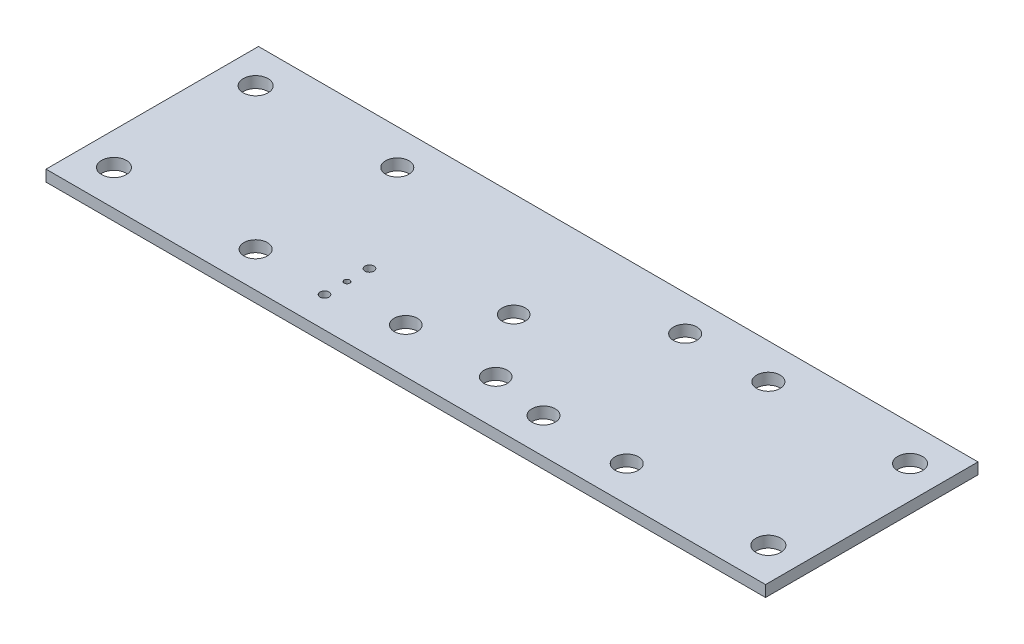
ISO-10303-21;
HEADER;
FILE_DESCRIPTION(('STEP AP214'),'2;1');
FILE_NAME('part.step','',(''),(''),'','','');
FILE_SCHEMA(('AUTOMOTIVE_DESIGN { 1 0 10303 214 1 1 1 1 }'));
ENDSEC;
DATA;
#1=APPLICATION_CONTEXT('core data for automotive mechanical design processes');
#2=APPLICATION_PROTOCOL_DEFINITION('international standard','automotive_design',2000,#1);
#3=PRODUCT_CONTEXT('',#1,'mechanical');
#4=PRODUCT('Part','Part','',(#3));
#5=PRODUCT_RELATED_PRODUCT_CATEGORY('part','',(#4));
#6=PRODUCT_DEFINITION_FORMATION('','',#4);
#7=PRODUCT_DEFINITION_CONTEXT('part definition',#1,'design');
#8=PRODUCT_DEFINITION('design','',#6,#7);
#9=PRODUCT_DEFINITION_SHAPE('','',#8);
#10=(LENGTH_UNIT() NAMED_UNIT(*) SI_UNIT(.MILLI.,.METRE.));
#11=(NAMED_UNIT(*) PLANE_ANGLE_UNIT() SI_UNIT($,.RADIAN.));
#12=(NAMED_UNIT(*) SI_UNIT($,.STERADIAN.) SOLID_ANGLE_UNIT());
#13=UNCERTAINTY_MEASURE_WITH_UNIT(LENGTH_MEASURE(1.E-05),#10,'distance_accuracy_value','');
#14=(GEOMETRIC_REPRESENTATION_CONTEXT(3) GLOBAL_UNCERTAINTY_ASSIGNED_CONTEXT((#13)) GLOBAL_UNIT_ASSIGNED_CONTEXT((#10,
#11,#12)) REPRESENTATION_CONTEXT('',''));
#15=CARTESIAN_POINT('',(0.,0.,0.));
#16=DIRECTION('',(0.,0.,1.));
#17=DIRECTION('',(1.,0.,0.));
#18=AXIS2_PLACEMENT_3D('',#15,#16,#17);
#19=CARTESIAN_POINT('',(0.,3.175,0.));
#20=DIRECTION('',(0.,1.,0.));
#21=DIRECTION('',(0.,0.,1.));
#22=AXIS2_PLACEMENT_3D('',#19,#20,#21);
#23=PLANE('',#22);
#24=CARTESIAN_POINT('',(28.9,3.175,-20.0000000000001));
#25=DIRECTION('',(0.,1.,0.));
#26=DIRECTION('',(0.,0.,1.));
#27=AXIS2_PLACEMENT_3D('',#24,#25,#26);
#28=CIRCLE('',#27,3.30000000000001);
#29=CARTESIAN_POINT('',(28.9,3.175,-16.7000000000001));
#30=VERTEX_POINT('',#29);
#31=EDGE_CURVE('E201',#30,#30,#28,.T.);
#32=ORIENTED_EDGE('',*,*,#31,.F.);
#33=EDGE_LOOP('',(#32));
#34=FACE_BOUND('',#33,.T.);
#35=CARTESIAN_POINT('',(28.9,3.175,19.9999999999999));
#36=DIRECTION('',(0.,1.,0.));
#37=DIRECTION('',(0.,0.,1.));
#38=AXIS2_PLACEMENT_3D('',#35,#36,#37);
#39=CIRCLE('',#38,3.30000000000001);
#40=CARTESIAN_POINT('',(28.9,3.175,23.2999999999999));
#41=VERTEX_POINT('',#40);
#42=EDGE_CURVE('E195',#41,#41,#39,.T.);
#43=ORIENTED_EDGE('',*,*,#42,.F.);
#44=EDGE_LOOP('',(#43));
#45=FACE_BOUND('',#44,.T.);
#46=CARTESIAN_POINT('',(-31.6,3.175,8.65000000000001));
#47=DIRECTION('',(0.,1.,0.));
#48=DIRECTION('',(0.,0.,1.));
#49=AXIS2_PLACEMENT_3D('',#46,#47,#48);
#50=CIRCLE('',#49,1.27);
#51=CARTESIAN_POINT('',(-31.6,3.175,9.92000000000001));
#52=VERTEX_POINT('',#51);
#53=EDGE_CURVE('E190',#52,#52,#50,.T.);
#54=ORIENTED_EDGE('',*,*,#53,.F.);
#55=EDGE_LOOP('',(#54));
#56=FACE_BOUND('',#55,.T.);
#57=CARTESIAN_POINT('',(-31.6,3.175,21.35));
#58=DIRECTION('',(0.,1.,0.));
#59=DIRECTION('',(0.,0.,1.));
#60=AXIS2_PLACEMENT_3D('',#57,#58,#59);
#61=CIRCLE('',#60,1.27);
#62=CARTESIAN_POINT('',(-31.6,3.175,22.62));
#63=VERTEX_POINT('',#62);
#64=EDGE_CURVE('E183',#63,#63,#61,.T.);
#65=ORIENTED_EDGE('',*,*,#64,.F.);
#66=EDGE_LOOP('',(#65));
#67=FACE_BOUND('',#66,.T.);
#68=CARTESIAN_POINT('',(-31.6,3.175,15.));
#69=DIRECTION('',(0.,1.,0.));
#70=DIRECTION('',(0.,0.,1.));
#71=AXIS2_PLACEMENT_3D('',#68,#69,#70);
#72=CIRCLE('',#71,0.793749999999992);
#73=CARTESIAN_POINT('',(-31.6,3.175,15.79375));
#74=VERTEX_POINT('',#73);
#75=EDGE_CURVE('E177',#74,#74,#72,.T.);
#76=ORIENTED_EDGE('',*,*,#75,.F.);
#77=EDGE_LOOP('',(#76));
#78=FACE_BOUND('',#77,.T.);
#79=CARTESIAN_POINT('',(12.7,3.175,17.3));
#80=DIRECTION('',(0.,1.,0.));
#81=DIRECTION('',(0.,0.,1.));
#82=AXIS2_PLACEMENT_3D('',#79,#80,#81);
#83=CIRCLE('',#82,3.2639);
#84=CARTESIAN_POINT('',(12.7,3.175,20.5639));
#85=VERTEX_POINT('',#84);
#86=EDGE_CURVE('E172',#85,#85,#83,.T.);
#87=ORIENTED_EDGE('',*,*,#86,.F.);
#88=EDGE_LOOP('',(#87));
#89=FACE_BOUND('',#88,.T.);
#90=CARTESIAN_POINT('',(0.,3.175,-0.479999999999982));
#91=DIRECTION('',(0.,1.,0.));
#92=DIRECTION('',(0.,0.,1.));
#93=AXIS2_PLACEMENT_3D('',#90,#91,#92);
#94=CIRCLE('',#93,3.2639);
#95=CARTESIAN_POINT('',(0.,3.175,2.78390000000002));
#96=VERTEX_POINT('',#95);
#97=EDGE_CURVE('E165',#96,#96,#94,.T.);
#98=ORIENTED_EDGE('',*,*,#97,.F.);
#99=EDGE_LOOP('',(#98));
#100=FACE_BOUND('',#99,.T.);
#101=CARTESIAN_POINT('',(-12.7,3.175,17.3));
#102=DIRECTION('',(0.,1.,0.));
#103=DIRECTION('',(0.,0.,1.));
#104=AXIS2_PLACEMENT_3D('',#101,#102,#103);
#105=CIRCLE('',#104,3.2639);
#106=CARTESIAN_POINT('',(-12.7,3.175,20.5639));
#107=VERTEX_POINT('',#106);
#108=EDGE_CURVE('E159',#107,#107,#105,.T.);
#109=ORIENTED_EDGE('',*,*,#108,.F.);
#110=EDGE_LOOP('',(#109));
#111=FACE_BOUND('',#110,.T.);
#112=CARTESIAN_POINT('',(92.4,3.175,19.9999999999999));
#113=DIRECTION('',(0.,1.,0.));
#114=DIRECTION('',(0.,0.,1.));
#115=AXIS2_PLACEMENT_3D('',#112,#113,#114);
#116=CIRCLE('',#115,3.49999999999999);
#117=CARTESIAN_POINT('',(92.4,3.175,23.4999999999999));
#118=VERTEX_POINT('',#117);
#119=EDGE_CURVE('E144',#118,#118,#116,.T.);
#120=ORIENTED_EDGE('',*,*,#119,.F.);
#121=EDGE_LOOP('',(#120));
#122=FACE_BOUND('',#121,.T.);
#123=CARTESIAN_POINT('',(92.3999999999999,3.175,-20.0000000000001));
#124=DIRECTION('',(0.,1.,0.));
#125=DIRECTION('',(0.,0.,-1.));
#126=AXIS2_PLACEMENT_3D('',#123,#124,#125);
#127=CIRCLE('',#126,3.49999999999999);
#128=CARTESIAN_POINT('',(92.3999999999999,3.175,-23.5000000000001));
#129=VERTEX_POINT('',#128);
#130=EDGE_CURVE('E132',#129,#129,#127,.T.);
#131=ORIENTED_EDGE('',*,*,#130,.F.);
#132=EDGE_LOOP('',(#131));
#133=FACE_BOUND('',#132,.T.);
#134=CARTESIAN_POINT('',(-52.4,3.175,20.));
#135=DIRECTION('',(0.,1.,0.));
#136=DIRECTION('',(0.,0.,-1.));
#137=AXIS2_PLACEMENT_3D('',#134,#135,#136);
#138=CIRCLE('',#137,3.3);
#139=CARTESIAN_POINT('',(-52.4,3.175,16.7));
#140=VERTEX_POINT('',#139);
#141=EDGE_CURVE('E120',#140,#140,#138,.T.);
#142=ORIENTED_EDGE('',*,*,#141,.F.);
#143=EDGE_LOOP('',(#142));
#144=FACE_BOUND('',#143,.T.);
#145=CARTESIAN_POINT('',(-52.4,3.175,-20.));
#146=DIRECTION('',(0.,1.,0.));
#147=DIRECTION('',(0.,0.,1.));
#148=AXIS2_PLACEMENT_3D('',#145,#146,#147);
#149=CIRCLE('',#148,3.3);
#150=CARTESIAN_POINT('',(-52.4,3.175,-16.7));
#151=VERTEX_POINT('',#150);
#152=EDGE_CURVE('E99',#151,#151,#149,.T.);
#153=ORIENTED_EDGE('',*,*,#152,.F.);
#154=EDGE_LOOP('',(#153));
#155=FACE_BOUND('',#154,.T.);
#156=DIRECTION('',(0.,0.,-1.));
#157=VECTOR('',#156,1.);
#158=CARTESIAN_POINT('',(101.6,3.175,-30.));
#159=LINE('',#158,#157);
#160=CARTESIAN_POINT('',(101.6,3.175,30.));
#161=VERTEX_POINT('',#160);
#162=CARTESIAN_POINT('',(101.6,3.175,-30.));
#163=VERTEX_POINT('',#162);
#164=EDGE_CURVE('E84',#161,#163,#159,.T.);
#165=ORIENTED_EDGE('',*,*,#164,.T.);
#166=DIRECTION('',(-1.,0.,0.));
#167=VECTOR('',#166,1.);
#168=CARTESIAN_POINT('',(-101.6,3.175,-30.));
#169=LINE('',#168,#167);
#170=CARTESIAN_POINT('',(-101.6,3.175,-30.));
#171=VERTEX_POINT('',#170);
#172=EDGE_CURVE('E79',#163,#171,#169,.T.);
#173=ORIENTED_EDGE('',*,*,#172,.T.);
#174=DIRECTION('',(0.,0.,1.));
#175=VECTOR('',#174,1.);
#176=CARTESIAN_POINT('',(-101.6,3.175,-30.));
#177=LINE('',#176,#175);
#178=CARTESIAN_POINT('',(-101.6,3.175,30.));
#179=VERTEX_POINT('',#178);
#180=EDGE_CURVE('E82',#171,#179,#177,.T.);
#181=ORIENTED_EDGE('',*,*,#180,.T.);
#182=DIRECTION('',(1.,0.,0.));
#183=VECTOR('',#182,1.);
#184=CARTESIAN_POINT('',(-101.6,3.175,30.));
#185=LINE('',#184,#183);
#186=EDGE_CURVE('E49',#179,#161,#185,.T.);
#187=ORIENTED_EDGE('',*,*,#186,.T.);
#188=EDGE_LOOP('',(#165,#173,#181,#187));
#189=FACE_BOUND('',#188,.T.);
#190=CARTESIAN_POINT('',(-92.4,3.175,20.));
#191=DIRECTION('',(0.,1.,0.));
#192=DIRECTION('',(0.,0.,-1.));
#193=AXIS2_PLACEMENT_3D('',#190,#191,#192);
#194=CIRCLE('',#193,3.49999999999999);
#195=CARTESIAN_POINT('',(-92.4,3.175,16.5));
#196=VERTEX_POINT('',#195);
#197=EDGE_CURVE('E114',#196,#196,#194,.T.);
#198=ORIENTED_EDGE('',*,*,#197,.F.);
#199=EDGE_LOOP('',(#198));
#200=FACE_BOUND('',#199,.T.);
#201=CARTESIAN_POINT('',(-92.4,3.175,-20.));
#202=DIRECTION('',(0.,1.,0.));
#203=DIRECTION('',(0.,0.,1.));
#204=AXIS2_PLACEMENT_3D('',#201,#202,#203);
#205=CIRCLE('',#204,3.49999999999999);
#206=CARTESIAN_POINT('',(-92.4,3.175,-16.5));
#207=VERTEX_POINT('',#206);
#208=EDGE_CURVE('E126',#207,#207,#205,.T.);
#209=ORIENTED_EDGE('',*,*,#208,.F.);
#210=EDGE_LOOP('',(#209));
#211=FACE_BOUND('',#210,.T.);
#212=CARTESIAN_POINT('',(52.4,3.175,19.9999999999999));
#213=DIRECTION('',(0.,1.,0.));
#214=DIRECTION('',(0.,0.,1.));
#215=AXIS2_PLACEMENT_3D('',#212,#213,#214);
#216=CIRCLE('',#215,3.29999999999999);
#217=CARTESIAN_POINT('',(52.4,3.175,23.2999999999999));
#218=VERTEX_POINT('',#217);
#219=EDGE_CURVE('E138',#218,#218,#216,.T.);
#220=ORIENTED_EDGE('',*,*,#219,.F.);
#221=EDGE_LOOP('',(#220));
#222=FACE_BOUND('',#221,.T.);
#223=CARTESIAN_POINT('',(52.4,3.175,-20.0000000000001));
#224=DIRECTION('',(0.,1.,0.));
#225=DIRECTION('',(0.,0.,-1.));
#226=AXIS2_PLACEMENT_3D('',#223,#224,#225);
#227=CIRCLE('',#226,3.30000000000002);
#228=CARTESIAN_POINT('',(52.4,3.175,-23.3000000000001));
#229=VERTEX_POINT('',#228);
#230=EDGE_CURVE('E150',#229,#229,#227,.T.);
#231=ORIENTED_EDGE('',*,*,#230,.F.);
#232=EDGE_LOOP('',(#231));
#233=FACE_BOUND('',#232,.T.);
#234=ADVANCED_FACE('F32',(#34,#45,#56,#67,#78,#89,#100,#111,#122,#133,#144,#155,#189,#200,#211,
#222,#233),#23,.T.);
#235=CARTESIAN_POINT('',(0.,0.,0.));
#236=DIRECTION('',(0.,1.,0.));
#237=DIRECTION('',(0.,0.,1.));
#238=AXIS2_PLACEMENT_3D('',#235,#236,#237);
#239=PLANE('',#238);
#240=CARTESIAN_POINT('',(28.9,0.,-20.0000000000001));
#241=DIRECTION('',(0.,1.,0.));
#242=DIRECTION('',(0.,0.,1.));
#243=AXIS2_PLACEMENT_3D('',#240,#241,#242);
#244=CIRCLE('',#243,3.30000000000001);
#245=CARTESIAN_POINT('',(28.9,0.,-16.7000000000001));
#246=VERTEX_POINT('',#245);
#247=EDGE_CURVE('E198',#246,#246,#244,.T.);
#248=ORIENTED_EDGE('',*,*,#247,.T.);
#249=EDGE_LOOP('',(#248));
#250=FACE_BOUND('',#249,.T.);
#251=CARTESIAN_POINT('',(28.9,0.,19.9999999999999));
#252=DIRECTION('',(0.,1.,0.));
#253=DIRECTION('',(0.,0.,1.));
#254=AXIS2_PLACEMENT_3D('',#251,#252,#253);
#255=CIRCLE('',#254,3.30000000000001);
#256=CARTESIAN_POINT('',(28.9,0.,23.2999999999999));
#257=VERTEX_POINT('',#256);
#258=EDGE_CURVE('E187',#257,#257,#255,.T.);
#259=ORIENTED_EDGE('',*,*,#258,.T.);
#260=EDGE_LOOP('',(#259));
#261=FACE_BOUND('',#260,.T.);
#262=CARTESIAN_POINT('',(-31.6,0.,8.65000000000001));
#263=DIRECTION('',(0.,1.,0.));
#264=DIRECTION('',(0.,0.,1.));
#265=AXIS2_PLACEMENT_3D('',#262,#263,#264);
#266=CIRCLE('',#265,1.27);
#267=CARTESIAN_POINT('',(-31.6,0.,9.92000000000001));
#268=VERTEX_POINT('',#267);
#269=EDGE_CURVE('E180',#268,#268,#266,.T.);
#270=ORIENTED_EDGE('',*,*,#269,.T.);
#271=EDGE_LOOP('',(#270));
#272=FACE_BOUND('',#271,.T.);
#273=CARTESIAN_POINT('',(-31.6,0.,21.35));
#274=DIRECTION('',(0.,1.,0.));
#275=DIRECTION('',(0.,0.,1.));
#276=AXIS2_PLACEMENT_3D('',#273,#274,#275);
#277=CIRCLE('',#276,1.27);
#278=CARTESIAN_POINT('',(-31.6,0.,22.62));
#279=VERTEX_POINT('',#278);
#280=EDGE_CURVE('E186',#279,#279,#277,.T.);
#281=ORIENTED_EDGE('',*,*,#280,.T.);
#282=EDGE_LOOP('',(#281));
#283=FACE_BOUND('',#282,.T.);
#284=CARTESIAN_POINT('',(-31.6,0.,15.));
#285=DIRECTION('',(0.,1.,0.));
#286=DIRECTION('',(0.,0.,1.));
#287=AXIS2_PLACEMENT_3D('',#284,#285,#286);
#288=CIRCLE('',#287,0.793749999999992);
#289=CARTESIAN_POINT('',(-31.6,0.,15.79375));
#290=VERTEX_POINT('',#289);
#291=EDGE_CURVE('E169',#290,#290,#288,.T.);
#292=ORIENTED_EDGE('',*,*,#291,.T.);
#293=EDGE_LOOP('',(#292));
#294=FACE_BOUND('',#293,.T.);
#295=CARTESIAN_POINT('',(12.7,0.,17.3));
#296=DIRECTION('',(0.,1.,0.));
#297=DIRECTION('',(0.,0.,1.));
#298=AXIS2_PLACEMENT_3D('',#295,#296,#297);
#299=CIRCLE('',#298,3.2639);
#300=CARTESIAN_POINT('',(12.7,0.,20.5639));
#301=VERTEX_POINT('',#300);
#302=EDGE_CURVE('E162',#301,#301,#299,.T.);
#303=ORIENTED_EDGE('',*,*,#302,.T.);
#304=EDGE_LOOP('',(#303));
#305=FACE_BOUND('',#304,.T.);
#306=CARTESIAN_POINT('',(0.,0.,-0.479999999999982));
#307=DIRECTION('',(0.,1.,0.));
#308=DIRECTION('',(0.,0.,1.));
#309=AXIS2_PLACEMENT_3D('',#306,#307,#308);
#310=CIRCLE('',#309,3.2639);
#311=CARTESIAN_POINT('',(0.,0.,2.78390000000002));
#312=VERTEX_POINT('',#311);
#313=EDGE_CURVE('E168',#312,#312,#310,.T.);
#314=ORIENTED_EDGE('',*,*,#313,.T.);
#315=EDGE_LOOP('',(#314));
#316=FACE_BOUND('',#315,.T.);
#317=CARTESIAN_POINT('',(-12.7,0.,17.3));
#318=DIRECTION('',(0.,1.,0.));
#319=DIRECTION('',(0.,0.,1.));
#320=AXIS2_PLACEMENT_3D('',#317,#318,#319);
#321=CIRCLE('',#320,3.2639);
#322=CARTESIAN_POINT('',(-12.7,0.,20.5639));
#323=VERTEX_POINT('',#322);
#324=EDGE_CURVE('E156',#323,#323,#321,.T.);
#325=ORIENTED_EDGE('',*,*,#324,.T.);
#326=EDGE_LOOP('',(#325));
#327=FACE_BOUND('',#326,.T.);
#328=DIRECTION('',(0.,0.,-1.));
#329=VECTOR('',#328,1.);
#330=CARTESIAN_POINT('',(101.6,0.,-30.));
#331=LINE('',#330,#329);
#332=CARTESIAN_POINT('',(101.6,0.,30.));
#333=VERTEX_POINT('',#332);
#334=CARTESIAN_POINT('',(101.6,0.,-30.));
#335=VERTEX_POINT('',#334);
#336=EDGE_CURVE('E96',#333,#335,#331,.T.);
#337=ORIENTED_EDGE('',*,*,#336,.F.);
#338=DIRECTION('',(1.,0.,0.));
#339=VECTOR('',#338,1.);
#340=CARTESIAN_POINT('',(-101.6,0.,30.));
#341=LINE('',#340,#339);
#342=CARTESIAN_POINT('',(-101.6,0.,30.));
#343=VERTEX_POINT('',#342);
#344=EDGE_CURVE('E72',#343,#333,#341,.T.);
#345=ORIENTED_EDGE('',*,*,#344,.F.);
#346=DIRECTION('',(0.,0.,1.));
#347=VECTOR('',#346,1.);
#348=CARTESIAN_POINT('',(-101.6,0.,-30.));
#349=LINE('',#348,#347);
#350=CARTESIAN_POINT('',(-101.6,0.,-30.));
#351=VERTEX_POINT('',#350);
#352=EDGE_CURVE('E66',#351,#343,#349,.T.);
#353=ORIENTED_EDGE('',*,*,#352,.F.);
#354=DIRECTION('',(-1.,0.,0.));
#355=VECTOR('',#354,1.);
#356=CARTESIAN_POINT('',(-101.6,0.,-30.));
#357=LINE('',#356,#355);
#358=EDGE_CURVE('E88',#335,#351,#357,.T.);
#359=ORIENTED_EDGE('',*,*,#358,.F.);
#360=EDGE_LOOP('',(#337,#345,#353,#359));
#361=FACE_BOUND('',#360,.T.);
#362=CARTESIAN_POINT('',(-52.4,0.,-20.));
#363=DIRECTION('',(0.,1.,0.));
#364=DIRECTION('',(0.,0.,1.));
#365=AXIS2_PLACEMENT_3D('',#362,#363,#364);
#366=CIRCLE('',#365,3.3);
#367=CARTESIAN_POINT('',(-52.4,0.,-16.7));
#368=VERTEX_POINT('',#367);
#369=EDGE_CURVE('E111',#368,#368,#366,.T.);
#370=ORIENTED_EDGE('',*,*,#369,.T.);
#371=EDGE_LOOP('',(#370));
#372=FACE_BOUND('',#371,.T.);
#373=CARTESIAN_POINT('',(-92.4,0.,20.));
#374=DIRECTION('',(0.,1.,0.));
#375=DIRECTION('',(0.,0.,-1.));
#376=AXIS2_PLACEMENT_3D('',#373,#374,#375);
#377=CIRCLE('',#376,3.49999999999999);
#378=CARTESIAN_POINT('',(-92.4,0.,16.5));
#379=VERTEX_POINT('',#378);
#380=EDGE_CURVE('E117',#379,#379,#377,.T.);
#381=ORIENTED_EDGE('',*,*,#380,.T.);
#382=EDGE_LOOP('',(#381));
#383=FACE_BOUND('',#382,.T.);
#384=CARTESIAN_POINT('',(-52.4,0.,20.));
#385=DIRECTION('',(0.,1.,0.));
#386=DIRECTION('',(0.,0.,-1.));
#387=AXIS2_PLACEMENT_3D('',#384,#385,#386);
#388=CIRCLE('',#387,3.3);
#389=CARTESIAN_POINT('',(-52.4,0.,16.7));
#390=VERTEX_POINT('',#389);
#391=EDGE_CURVE('E123',#390,#390,#388,.T.);
#392=ORIENTED_EDGE('',*,*,#391,.T.);
#393=EDGE_LOOP('',(#392));
#394=FACE_BOUND('',#393,.T.);
#395=CARTESIAN_POINT('',(-92.4,0.,-20.));
#396=DIRECTION('',(0.,1.,0.));
#397=DIRECTION('',(0.,0.,1.));
#398=AXIS2_PLACEMENT_3D('',#395,#396,#397);
#399=CIRCLE('',#398,3.49999999999999);
#400=CARTESIAN_POINT('',(-92.4,0.,-16.5));
#401=VERTEX_POINT('',#400);
#402=EDGE_CURVE('E129',#401,#401,#399,.T.);
#403=ORIENTED_EDGE('',*,*,#402,.T.);
#404=EDGE_LOOP('',(#403));
#405=FACE_BOUND('',#404,.T.);
#406=CARTESIAN_POINT('',(92.3999999999999,0.,-20.0000000000001));
#407=DIRECTION('',(0.,1.,0.));
#408=DIRECTION('',(0.,0.,-1.));
#409=AXIS2_PLACEMENT_3D('',#406,#407,#408);
#410=CIRCLE('',#409,3.49999999999999);
#411=CARTESIAN_POINT('',(92.3999999999999,0.,-23.5000000000001));
#412=VERTEX_POINT('',#411);
#413=EDGE_CURVE('E135',#412,#412,#410,.T.);
#414=ORIENTED_EDGE('',*,*,#413,.T.);
#415=EDGE_LOOP('',(#414));
#416=FACE_BOUND('',#415,.T.);
#417=CARTESIAN_POINT('',(52.4,0.,19.9999999999999));
#418=DIRECTION('',(0.,1.,0.));
#419=DIRECTION('',(0.,0.,1.));
#420=AXIS2_PLACEMENT_3D('',#417,#418,#419);
#421=CIRCLE('',#420,3.29999999999999);
#422=CARTESIAN_POINT('',(52.4,0.,23.2999999999999));
#423=VERTEX_POINT('',#422);
#424=EDGE_CURVE('E141',#423,#423,#421,.T.);
#425=ORIENTED_EDGE('',*,*,#424,.T.);
#426=EDGE_LOOP('',(#425));
#427=FACE_BOUND('',#426,.T.);
#428=CARTESIAN_POINT('',(92.4,0.,19.9999999999999));
#429=DIRECTION('',(0.,1.,0.));
#430=DIRECTION('',(0.,0.,1.));
#431=AXIS2_PLACEMENT_3D('',#428,#429,#430);
#432=CIRCLE('',#431,3.49999999999999);
#433=CARTESIAN_POINT('',(92.4,0.,23.4999999999999));
#434=VERTEX_POINT('',#433);
#435=EDGE_CURVE('E147',#434,#434,#432,.T.);
#436=ORIENTED_EDGE('',*,*,#435,.T.);
#437=EDGE_LOOP('',(#436));
#438=FACE_BOUND('',#437,.T.);
#439=CARTESIAN_POINT('',(52.4,0.,-20.0000000000001));
#440=DIRECTION('',(0.,1.,0.));
#441=DIRECTION('',(0.,0.,-1.));
#442=AXIS2_PLACEMENT_3D('',#439,#440,#441);
#443=CIRCLE('',#442,3.30000000000002);
#444=CARTESIAN_POINT('',(52.4,0.,-23.3000000000001));
#445=VERTEX_POINT('',#444);
#446=EDGE_CURVE('E153',#445,#445,#443,.T.);
#447=ORIENTED_EDGE('',*,*,#446,.T.);
#448=EDGE_LOOP('',(#447));
#449=FACE_BOUND('',#448,.T.);
#450=ADVANCED_FACE('F107',(#250,#261,#272,#283,#294,#305,#316,#327,#361,#372,#383,#394,#405,
#416,#427,#438,#449),#239,.F.);
#451=CARTESIAN_POINT('',(101.6,3.175,-30.));
#452=DIRECTION('',(-1.,0.,0.));
#453=DIRECTION('',(0.,0.,1.));
#454=AXIS2_PLACEMENT_3D('',#451,#452,#453);
#455=PLANE('',#454);
#456=ORIENTED_EDGE('',*,*,#336,.T.);
#457=DIRECTION('',(0.,-1.,0.));
#458=VECTOR('',#457,1.);
#459=CARTESIAN_POINT('',(101.6,3.175,-30.));
#460=LINE('',#459,#458);
#461=EDGE_CURVE('E11',#163,#335,#460,.T.);
#462=ORIENTED_EDGE('',*,*,#461,.F.);
#463=ORIENTED_EDGE('',*,*,#164,.F.);
#464=DIRECTION('',(0.,-1.,0.));
#465=VECTOR('',#464,1.);
#466=CARTESIAN_POINT('',(101.6,3.175,30.));
#467=LINE('',#466,#465);
#468=EDGE_CURVE('E92',#161,#333,#467,.T.);
#469=ORIENTED_EDGE('',*,*,#468,.T.);
#470=EDGE_LOOP('',(#456,#462,#463,#469));
#471=FACE_BOUND('',#470,.T.);
#472=ADVANCED_FACE('F34',(#471),#455,.F.);
#473=CARTESIAN_POINT('',(-101.6,3.175,-30.));
#474=DIRECTION('',(0.,0.,1.));
#475=DIRECTION('',(1.,0.,0.));
#476=AXIS2_PLACEMENT_3D('',#473,#474,#475);
#477=PLANE('',#476);
#478=ORIENTED_EDGE('',*,*,#358,.T.);
#479=DIRECTION('',(0.,-1.,0.));
#480=VECTOR('',#479,1.);
#481=CARTESIAN_POINT('',(-101.6,3.175,-30.));
#482=LINE('',#481,#480);
#483=EDGE_CURVE('E41',#171,#351,#482,.T.);
#484=ORIENTED_EDGE('',*,*,#483,.F.);
#485=ORIENTED_EDGE('',*,*,#172,.F.);
#486=ORIENTED_EDGE('',*,*,#461,.T.);
#487=EDGE_LOOP('',(#478,#484,#485,#486));
#488=FACE_BOUND('',#487,.T.);
#489=ADVANCED_FACE('F87',(#488),#477,.F.);
#490=CARTESIAN_POINT('',(-101.6,3.175,-30.));
#491=DIRECTION('',(1.,0.,0.));
#492=DIRECTION('',(0.,0.,-1.));
#493=AXIS2_PLACEMENT_3D('',#490,#491,#492);
#494=PLANE('',#493);
#495=ORIENTED_EDGE('',*,*,#352,.T.);
#496=DIRECTION('',(0.,-1.,0.));
#497=VECTOR('',#496,1.);
#498=CARTESIAN_POINT('',(-101.6,3.175,30.));
#499=LINE('',#498,#497);
#500=EDGE_CURVE('E89',#179,#343,#499,.T.);
#501=ORIENTED_EDGE('',*,*,#500,.F.);
#502=ORIENTED_EDGE('',*,*,#180,.F.);
#503=ORIENTED_EDGE('',*,*,#483,.T.);
#504=EDGE_LOOP('',(#495,#501,#502,#503));
#505=FACE_BOUND('',#504,.T.);
#506=ADVANCED_FACE('F90',(#505),#494,.F.);
#507=CARTESIAN_POINT('',(-101.6,3.175,30.));
#508=DIRECTION('',(0.,0.,-1.));
#509=DIRECTION('',(-1.,0.,0.));
#510=AXIS2_PLACEMENT_3D('',#507,#508,#509);
#511=PLANE('',#510);
#512=ORIENTED_EDGE('',*,*,#344,.T.);
#513=ORIENTED_EDGE('',*,*,#468,.F.);
#514=ORIENTED_EDGE('',*,*,#186,.F.);
#515=ORIENTED_EDGE('',*,*,#500,.T.);
#516=EDGE_LOOP('',(#512,#513,#514,#515));
#517=FACE_BOUND('',#516,.T.);
#518=ADVANCED_FACE('F104',(#517),#511,.F.);
#519=CARTESIAN_POINT('',(-52.4,3.175,-20.));
#520=DIRECTION('',(0.,-1.,0.));
#521=DIRECTION('',(0.,0.,-1.));
#522=AXIS2_PLACEMENT_3D('',#519,#520,#521);
#523=CYLINDRICAL_SURFACE('',#522,3.3);
#524=ORIENTED_EDGE('',*,*,#152,.T.);
#525=EDGE_LOOP('',(#524));
#526=FACE_BOUND('',#525,.T.);
#527=ORIENTED_EDGE('',*,*,#369,.F.);
#528=EDGE_LOOP('',(#527));
#529=FACE_BOUND('',#528,.T.);
#530=ADVANCED_FACE('F241',(#526,#529),#523,.F.);
#531=CARTESIAN_POINT('',(-92.4,3.175,20.));
#532=DIRECTION('',(0.,-1.,0.));
#533=DIRECTION('',(0.,0.,-1.));
#534=AXIS2_PLACEMENT_3D('',#531,#532,#533);
#535=CYLINDRICAL_SURFACE('',#534,3.49999999999999);
#536=ORIENTED_EDGE('',*,*,#197,.T.);
#537=EDGE_LOOP('',(#536));
#538=FACE_BOUND('',#537,.T.);
#539=ORIENTED_EDGE('',*,*,#380,.F.);
#540=EDGE_LOOP('',(#539));
#541=FACE_BOUND('',#540,.T.);
#542=ADVANCED_FACE('F244',(#538,#541),#535,.F.);
#543=CARTESIAN_POINT('',(-52.4,3.175,20.));
#544=DIRECTION('',(0.,-1.,0.));
#545=DIRECTION('',(0.,0.,-1.));
#546=AXIS2_PLACEMENT_3D('',#543,#544,#545);
#547=CYLINDRICAL_SURFACE('',#546,3.3);
#548=ORIENTED_EDGE('',*,*,#141,.T.);
#549=EDGE_LOOP('',(#548));
#550=FACE_BOUND('',#549,.T.);
#551=ORIENTED_EDGE('',*,*,#391,.F.);
#552=EDGE_LOOP('',(#551));
#553=FACE_BOUND('',#552,.T.);
#554=ADVANCED_FACE('F292',(#550,#553),#547,.F.);
#555=CARTESIAN_POINT('',(-92.4,3.175,-20.));
#556=DIRECTION('',(0.,-1.,0.));
#557=DIRECTION('',(0.,0.,-1.));
#558=AXIS2_PLACEMENT_3D('',#555,#556,#557);
#559=CYLINDRICAL_SURFACE('',#558,3.49999999999999);
#560=ORIENTED_EDGE('',*,*,#208,.T.);
#561=EDGE_LOOP('',(#560));
#562=FACE_BOUND('',#561,.T.);
#563=ORIENTED_EDGE('',*,*,#402,.F.);
#564=EDGE_LOOP('',(#563));
#565=FACE_BOUND('',#564,.T.);
#566=ADVANCED_FACE('F288',(#562,#565),#559,.F.);
#567=CARTESIAN_POINT('',(92.3999999999999,3.175,-20.0000000000001));
#568=DIRECTION('',(0.,-1.,0.));
#569=DIRECTION('',(0.,0.,-1.));
#570=AXIS2_PLACEMENT_3D('',#567,#568,#569);
#571=CYLINDRICAL_SURFACE('',#570,3.49999999999999);
#572=ORIENTED_EDGE('',*,*,#130,.T.);
#573=EDGE_LOOP('',(#572));
#574=FACE_BOUND('',#573,.T.);
#575=ORIENTED_EDGE('',*,*,#413,.F.);
#576=EDGE_LOOP('',(#575));
#577=FACE_BOUND('',#576,.T.);
#578=ADVANCED_FACE('F284',(#574,#577),#571,.F.);
#579=CARTESIAN_POINT('',(52.4,3.175,19.9999999999999));
#580=DIRECTION('',(0.,-1.,0.));
#581=DIRECTION('',(0.,0.,-1.));
#582=AXIS2_PLACEMENT_3D('',#579,#580,#581);
#583=CYLINDRICAL_SURFACE('',#582,3.29999999999999);
#584=ORIENTED_EDGE('',*,*,#219,.T.);
#585=EDGE_LOOP('',(#584));
#586=FACE_BOUND('',#585,.T.);
#587=ORIENTED_EDGE('',*,*,#424,.F.);
#588=EDGE_LOOP('',(#587));
#589=FACE_BOUND('',#588,.T.);
#590=ADVANCED_FACE('F277',(#586,#589),#583,.F.);
#591=CARTESIAN_POINT('',(92.4,3.175,19.9999999999999));
#592=DIRECTION('',(0.,-1.,0.));
#593=DIRECTION('',(0.,0.,-1.));
#594=AXIS2_PLACEMENT_3D('',#591,#592,#593);
#595=CYLINDRICAL_SURFACE('',#594,3.49999999999999);
#596=ORIENTED_EDGE('',*,*,#119,.T.);
#597=EDGE_LOOP('',(#596));
#598=FACE_BOUND('',#597,.T.);
#599=ORIENTED_EDGE('',*,*,#435,.F.);
#600=EDGE_LOOP('',(#599));
#601=FACE_BOUND('',#600,.T.);
#602=ADVANCED_FACE('F267',(#598,#601),#595,.F.);
#603=CARTESIAN_POINT('',(52.4,3.175,-20.0000000000001));
#604=DIRECTION('',(0.,-1.,0.));
#605=DIRECTION('',(0.,0.,-1.));
#606=AXIS2_PLACEMENT_3D('',#603,#604,#605);
#607=CYLINDRICAL_SURFACE('',#606,3.30000000000002);
#608=ORIENTED_EDGE('',*,*,#230,.T.);
#609=EDGE_LOOP('',(#608));
#610=FACE_BOUND('',#609,.T.);
#611=ORIENTED_EDGE('',*,*,#446,.F.);
#612=EDGE_LOOP('',(#611));
#613=FACE_BOUND('',#612,.T.);
#614=ADVANCED_FACE('F264',(#610,#613),#607,.F.);
#615=CARTESIAN_POINT('',(-12.7,0.,17.3));
#616=DIRECTION('',(0.,1.,0.));
#617=DIRECTION('',(0.,0.,1.));
#618=AXIS2_PLACEMENT_3D('',#615,#616,#617);
#619=CYLINDRICAL_SURFACE('',#618,3.2639);
#620=ORIENTED_EDGE('',*,*,#324,.F.);
#621=EDGE_LOOP('',(#620));
#622=FACE_BOUND('',#621,.T.);
#623=ORIENTED_EDGE('',*,*,#108,.T.);
#624=EDGE_LOOP('',(#623));
#625=FACE_BOUND('',#624,.T.);
#626=ADVANCED_FACE('F266',(#622,#625),#619,.F.);
#627=CARTESIAN_POINT('',(0.,0.,-0.479999999999982));
#628=DIRECTION('',(0.,1.,0.));
#629=DIRECTION('',(0.,0.,1.));
#630=AXIS2_PLACEMENT_3D('',#627,#628,#629);
#631=CYLINDRICAL_SURFACE('',#630,3.2639);
#632=ORIENTED_EDGE('',*,*,#313,.F.);
#633=EDGE_LOOP('',(#632));
#634=FACE_BOUND('',#633,.T.);
#635=ORIENTED_EDGE('',*,*,#97,.T.);
#636=EDGE_LOOP('',(#635));
#637=FACE_BOUND('',#636,.T.);
#638=ADVANCED_FACE('F274',(#634,#637),#631,.F.);
#639=CARTESIAN_POINT('',(12.7,0.,17.3));
#640=DIRECTION('',(0.,1.,0.));
#641=DIRECTION('',(0.,0.,1.));
#642=AXIS2_PLACEMENT_3D('',#639,#640,#641);
#643=CYLINDRICAL_SURFACE('',#642,3.2639);
#644=ORIENTED_EDGE('',*,*,#302,.F.);
#645=EDGE_LOOP('',(#644));
#646=FACE_BOUND('',#645,.T.);
#647=ORIENTED_EDGE('',*,*,#86,.T.);
#648=EDGE_LOOP('',(#647));
#649=FACE_BOUND('',#648,.T.);
#650=ADVANCED_FACE('F350',(#646,#649),#643,.F.);
#651=CARTESIAN_POINT('',(-31.6,0.,15.));
#652=DIRECTION('',(0.,1.,0.));
#653=DIRECTION('',(0.,0.,1.));
#654=AXIS2_PLACEMENT_3D('',#651,#652,#653);
#655=CYLINDRICAL_SURFACE('',#654,0.793749999999992);
#656=ORIENTED_EDGE('',*,*,#291,.F.);
#657=EDGE_LOOP('',(#656));
#658=FACE_BOUND('',#657,.T.);
#659=ORIENTED_EDGE('',*,*,#75,.T.);
#660=EDGE_LOOP('',(#659));
#661=FACE_BOUND('',#660,.T.);
#662=ADVANCED_FACE('F340',(#658,#661),#655,.F.);
#663=CARTESIAN_POINT('',(-31.6,0.,21.35));
#664=DIRECTION('',(0.,1.,0.));
#665=DIRECTION('',(0.,0.,1.));
#666=AXIS2_PLACEMENT_3D('',#663,#664,#665);
#667=CYLINDRICAL_SURFACE('',#666,1.27);
#668=ORIENTED_EDGE('',*,*,#280,.F.);
#669=EDGE_LOOP('',(#668));
#670=FACE_BOUND('',#669,.T.);
#671=ORIENTED_EDGE('',*,*,#64,.T.);
#672=EDGE_LOOP('',(#671));
#673=FACE_BOUND('',#672,.T.);
#674=ADVANCED_FACE('F328',(#670,#673),#667,.F.);
#675=CARTESIAN_POINT('',(-31.6,0.,8.65000000000001));
#676=DIRECTION('',(0.,1.,0.));
#677=DIRECTION('',(0.,0.,1.));
#678=AXIS2_PLACEMENT_3D('',#675,#676,#677);
#679=CYLINDRICAL_SURFACE('',#678,1.27);
#680=ORIENTED_EDGE('',*,*,#269,.F.);
#681=EDGE_LOOP('',(#680));
#682=FACE_BOUND('',#681,.T.);
#683=ORIENTED_EDGE('',*,*,#53,.T.);
#684=EDGE_LOOP('',(#683));
#685=FACE_BOUND('',#684,.T.);
#686=ADVANCED_FACE('F323',(#682,#685),#679,.F.);
#687=CARTESIAN_POINT('',(28.9,0.,19.9999999999999));
#688=DIRECTION('',(0.,1.,0.));
#689=DIRECTION('',(0.,0.,1.));
#690=AXIS2_PLACEMENT_3D('',#687,#688,#689);
#691=CYLINDRICAL_SURFACE('',#690,3.30000000000001);
#692=ORIENTED_EDGE('',*,*,#258,.F.);
#693=EDGE_LOOP('',(#692));
#694=FACE_BOUND('',#693,.T.);
#695=ORIENTED_EDGE('',*,*,#42,.T.);
#696=EDGE_LOOP('',(#695));
#697=FACE_BOUND('',#696,.T.);
#698=ADVANCED_FACE('F212',(#694,#697),#691,.F.);
#699=CARTESIAN_POINT('',(28.9,0.,-20.0000000000001));
#700=DIRECTION('',(0.,1.,0.));
#701=DIRECTION('',(0.,0.,1.));
#702=AXIS2_PLACEMENT_3D('',#699,#700,#701);
#703=CYLINDRICAL_SURFACE('',#702,3.30000000000001);
#704=ORIENTED_EDGE('',*,*,#247,.F.);
#705=EDGE_LOOP('',(#704));
#706=FACE_BOUND('',#705,.T.);
#707=ORIENTED_EDGE('',*,*,#31,.T.);
#708=EDGE_LOOP('',(#707));
#709=FACE_BOUND('',#708,.T.);
#710=ADVANCED_FACE('F209',(#706,#709),#703,.F.);
#711=CLOSED_SHELL('',(#234,#450,#472,#489,#506,#518,#530,#542,#554,#566,#578,#590,#602,#614,
#626,#638,#650,#662,#674,#686,#698,#710));
#712=MANIFOLD_SOLID_BREP('B2',#711);
#713=ADVANCED_BREP_SHAPE_REPRESENTATION('',(#18,#712),#14);
#714=SHAPE_DEFINITION_REPRESENTATION(#9,#713);
ENDSEC;
END-ISO-10303-21;
